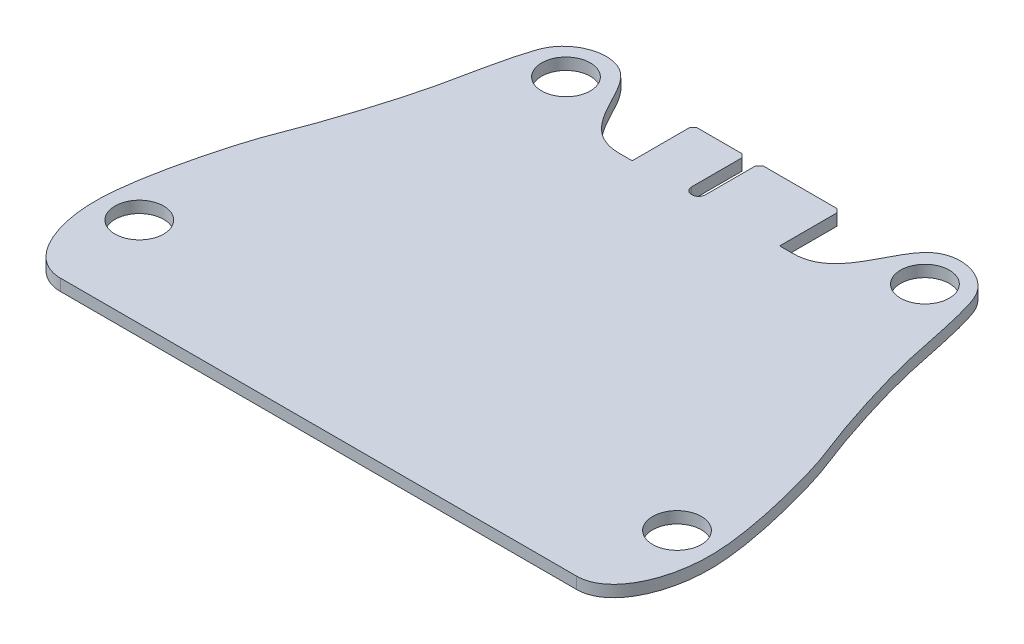
ISO-10303-21;
HEADER;
FILE_DESCRIPTION(('STEP AP214'),'2;1');
FILE_NAME('part.step','',(''),(''),'','','');
FILE_SCHEMA(('AUTOMOTIVE_DESIGN { 1 0 10303 214 1 1 1 1 }'));
ENDSEC;
DATA;
#1=APPLICATION_CONTEXT('core data for automotive mechanical design processes');
#2=APPLICATION_PROTOCOL_DEFINITION('international standard','automotive_design',2000,#1);
#3=PRODUCT_CONTEXT('',#1,'mechanical');
#4=PRODUCT('Part','Part','',(#3));
#5=PRODUCT_RELATED_PRODUCT_CATEGORY('part','',(#4));
#6=PRODUCT_DEFINITION_FORMATION('','',#4);
#7=PRODUCT_DEFINITION_CONTEXT('part definition',#1,'design');
#8=PRODUCT_DEFINITION('design','',#6,#7);
#9=PRODUCT_DEFINITION_SHAPE('','',#8);
#10=(LENGTH_UNIT() NAMED_UNIT(*) SI_UNIT(.MILLI.,.METRE.));
#11=(NAMED_UNIT(*) PLANE_ANGLE_UNIT() SI_UNIT($,.RADIAN.));
#12=(NAMED_UNIT(*) SI_UNIT($,.STERADIAN.) SOLID_ANGLE_UNIT());
#13=UNCERTAINTY_MEASURE_WITH_UNIT(LENGTH_MEASURE(1.E-05),#10,'distance_accuracy_value','');
#14=(GEOMETRIC_REPRESENTATION_CONTEXT(3) GLOBAL_UNCERTAINTY_ASSIGNED_CONTEXT((#13)) GLOBAL_UNIT_ASSIGNED_CONTEXT((#10,
#11,#12)) REPRESENTATION_CONTEXT('',''));
#15=CARTESIAN_POINT('',(0.,0.,0.));
#16=DIRECTION('',(0.,0.,1.));
#17=DIRECTION('',(1.,0.,0.));
#18=AXIS2_PLACEMENT_3D('',#15,#16,#17);
#19=CARTESIAN_POINT('',(-2.,-0.8,-29.258496614902));
#20=DIRECTION('',(0.,1.,0.));
#21=DIRECTION('',(0.,0.,1.));
#22=AXIS2_PLACEMENT_3D('',#19,#20,#21);
#23=CYLINDRICAL_SURFACE('',#22,0.951237048088933);
#24=DIRECTION('',(0.,1.,0.));
#25=VECTOR('',#24,1.);
#26=CARTESIAN_POINT('',(-2.95,-0.8,-29.21));
#27=LINE('',#26,#25);
#28=CARTESIAN_POINT('',(-2.95,-0.8,-29.21));
#29=VERTEX_POINT('',#28);
#30=CARTESIAN_POINT('',(-2.95,0.8,-29.21));
#31=VERTEX_POINT('',#30);
#32=EDGE_CURVE('E45',#29,#31,#27,.T.);
#33=ORIENTED_EDGE('',*,*,#32,.T.);
#34=CARTESIAN_POINT('',(-2.,0.8,-29.258496614902));
#35=DIRECTION('',(0.,1.,0.));
#36=DIRECTION('',(0.,0.,1.));
#37=AXIS2_PLACEMENT_3D('',#34,#35,#36);
#38=CIRCLE('',#37,0.951237048088933);
#39=CARTESIAN_POINT('',(-1.05,0.8,-29.21));
#40=VERTEX_POINT('',#39);
#41=EDGE_CURVE('E155',#31,#40,#38,.T.);
#42=ORIENTED_EDGE('',*,*,#41,.T.);
#43=DIRECTION('',(0.,1.,0.));
#44=VECTOR('',#43,1.);
#45=CARTESIAN_POINT('',(-1.05,-0.8,-29.21));
#46=LINE('',#45,#44);
#47=CARTESIAN_POINT('',(-1.05,-0.8,-29.21));
#48=VERTEX_POINT('',#47);
#49=EDGE_CURVE('E11',#48,#40,#46,.T.);
#50=ORIENTED_EDGE('',*,*,#49,.F.);
#51=CARTESIAN_POINT('',(-2.,-0.8,-29.258496614902));
#52=DIRECTION('',(0.,1.,0.));
#53=DIRECTION('',(0.,0.,1.));
#54=AXIS2_PLACEMENT_3D('',#51,#52,#53);
#55=CIRCLE('',#54,0.951237048088933);
#56=EDGE_CURVE('E157',#29,#48,#55,.T.);
#57=ORIENTED_EDGE('',*,*,#56,.F.);
#58=EDGE_LOOP('',(#33,#42,#50,#57));
#59=FACE_BOUND('',#58,.T.);
#60=ADVANCED_FACE('F42',(#59),#23,.F.);
#61=CARTESIAN_POINT('',(-1.05,-0.8,0.));
#62=DIRECTION('',(1.,0.,0.));
#63=DIRECTION('',(0.,0.,-1.));
#64=AXIS2_PLACEMENT_3D('',#61,#62,#63);
#65=PLANE('',#64);
#66=ORIENTED_EDGE('',*,*,#49,.T.);
#67=DIRECTION('',(0.,0.,-1.));
#68=VECTOR('',#67,1.);
#69=CARTESIAN_POINT('',(-1.05,0.8,0.));
#70=LINE('',#69,#68);
#71=CARTESIAN_POINT('',(-1.05,0.8,-36.16));
#72=VERTEX_POINT('',#71);
#73=EDGE_CURVE('E172',#40,#72,#70,.T.);
#74=ORIENTED_EDGE('',*,*,#73,.T.);
#75=DIRECTION('',(0.,1.,0.));
#76=VECTOR('',#75,1.);
#77=CARTESIAN_POINT('',(-1.05,-0.8,-36.16));
#78=LINE('',#77,#76);
#79=CARTESIAN_POINT('',(-1.05,-0.8,-36.16));
#80=VERTEX_POINT('',#79);
#81=EDGE_CURVE('E50',#80,#72,#78,.T.);
#82=ORIENTED_EDGE('',*,*,#81,.F.);
#83=DIRECTION('',(0.,0.,-1.));
#84=VECTOR('',#83,1.);
#85=CARTESIAN_POINT('',(-1.05,-0.8,0.));
#86=LINE('',#85,#84);
#87=EDGE_CURVE('E57',#48,#80,#86,.T.);
#88=ORIENTED_EDGE('',*,*,#87,.F.);
#89=EDGE_LOOP('',(#66,#74,#82,#88));
#90=FACE_BOUND('',#89,.T.);
#91=ADVANCED_FACE('F306',(#90),#65,.F.);
#92=CARTESIAN_POINT('',(-18.605,-0.8,-18.605));
#93=DIRECTION('',(0.707106781186548,0.,0.707106781186548));
#94=DIRECTION('',(0.707106781186548,0.,-0.707106781186548));
#95=AXIS2_PLACEMENT_3D('',#92,#93,#94);
#96=PLANE('',#95);
#97=ORIENTED_EDGE('',*,*,#81,.T.);
#98=DIRECTION('',(0.707106781186548,0.,-0.707106781186548));
#99=VECTOR('',#98,1.);
#100=CARTESIAN_POINT('',(-18.605,0.8,-18.605));
#101=LINE('',#100,#99);
#102=CARTESIAN_POINT('',(-0.550000000000002,0.8,-36.66));
#103=VERTEX_POINT('',#102);
#104=EDGE_CURVE('E223',#72,#103,#101,.T.);
#105=ORIENTED_EDGE('',*,*,#104,.T.);
#106=DIRECTION('',(0.,1.,0.));
#107=VECTOR('',#106,1.);
#108=CARTESIAN_POINT('',(-0.550000000000002,-0.8,-36.66));
#109=LINE('',#108,#107);
#110=CARTESIAN_POINT('',(-0.550000000000002,-0.8,-36.66));
#111=VERTEX_POINT('',#110);
#112=EDGE_CURVE('E368',#111,#103,#109,.T.);
#113=ORIENTED_EDGE('',*,*,#112,.F.);
#114=DIRECTION('',(0.707106781186548,0.,-0.707106781186548));
#115=VECTOR('',#114,1.);
#116=CARTESIAN_POINT('',(-18.605,-0.8,-18.605));
#117=LINE('',#116,#115);
#118=EDGE_CURVE('E353',#80,#111,#117,.T.);
#119=ORIENTED_EDGE('',*,*,#118,.F.);
#120=EDGE_LOOP('',(#97,#105,#113,#119));
#121=FACE_BOUND('',#120,.T.);
#122=ADVANCED_FACE('F310',(#121),#96,.F.);
#123=CARTESIAN_POINT('',(0.,-0.8,-36.66));
#124=DIRECTION('',(0.,0.,1.));
#125=DIRECTION('',(1.,0.,0.));
#126=AXIS2_PLACEMENT_3D('',#123,#124,#125);
#127=PLANE('',#126);
#128=ORIENTED_EDGE('',*,*,#112,.T.);
#129=DIRECTION('',(1.,0.,0.));
#130=VECTOR('',#129,1.);
#131=CARTESIAN_POINT('',(0.,0.8,-36.66));
#132=LINE('',#131,#130);
#133=CARTESIAN_POINT('',(9.65,0.8,-36.66));
#134=VERTEX_POINT('',#133);
#135=EDGE_CURVE('E220',#103,#134,#132,.T.);
#136=ORIENTED_EDGE('',*,*,#135,.T.);
#137=DIRECTION('',(0.,1.,0.));
#138=VECTOR('',#137,1.);
#139=CARTESIAN_POINT('',(9.65,-0.8,-36.66));
#140=LINE('',#139,#138);
#141=CARTESIAN_POINT('',(9.65,-0.8,-36.66));
#142=VERTEX_POINT('',#141);
#143=EDGE_CURVE('E370',#142,#134,#140,.T.);
#144=ORIENTED_EDGE('',*,*,#143,.F.);
#145=DIRECTION('',(1.,0.,0.));
#146=VECTOR('',#145,1.);
#147=CARTESIAN_POINT('',(0.,-0.8,-36.66));
#148=LINE('',#147,#146);
#149=EDGE_CURVE('E351',#111,#142,#148,.T.);
#150=ORIENTED_EDGE('',*,*,#149,.F.);
#151=EDGE_LOOP('',(#128,#136,#144,#150));
#152=FACE_BOUND('',#151,.T.);
#153=ADVANCED_FACE('F315',(#152),#127,.F.);
#154=CARTESIAN_POINT('',(23.155,-0.8,-23.155));
#155=DIRECTION('',(-0.707106781186548,0.,0.707106781186548));
#156=DIRECTION('',(0.707106781186548,0.,0.707106781186548));
#157=AXIS2_PLACEMENT_3D('',#154,#155,#156);
#158=PLANE('',#157);
#159=ORIENTED_EDGE('',*,*,#143,.T.);
#160=DIRECTION('',(0.707106781186548,0.,0.707106781186548));
#161=VECTOR('',#160,1.);
#162=CARTESIAN_POINT('',(23.155,0.8,-23.155));
#163=LINE('',#162,#161);
#164=CARTESIAN_POINT('',(10.15,0.8,-36.16));
#165=VERTEX_POINT('',#164);
#166=EDGE_CURVE('E217',#134,#165,#163,.T.);
#167=ORIENTED_EDGE('',*,*,#166,.T.);
#168=DIRECTION('',(0.,1.,0.));
#169=VECTOR('',#168,1.);
#170=CARTESIAN_POINT('',(10.15,-0.8,-36.16));
#171=LINE('',#170,#169);
#172=CARTESIAN_POINT('',(10.15,-0.8,-36.16));
#173=VERTEX_POINT('',#172);
#174=EDGE_CURVE('E372',#173,#165,#171,.T.);
#175=ORIENTED_EDGE('',*,*,#174,.F.);
#176=DIRECTION('',(0.707106781186548,0.,0.707106781186548));
#177=VECTOR('',#176,1.);
#178=CARTESIAN_POINT('',(23.155,-0.8,-23.155));
#179=LINE('',#178,#177);
#180=EDGE_CURVE('E349',#142,#173,#179,.T.);
#181=ORIENTED_EDGE('',*,*,#180,.F.);
#182=EDGE_LOOP('',(#159,#167,#175,#181));
#183=FACE_BOUND('',#182,.T.);
#184=ADVANCED_FACE('F322',(#183),#158,.F.);
#185=CARTESIAN_POINT('',(10.15,-0.8,0.));
#186=DIRECTION('',(-1.,0.,0.));
#187=DIRECTION('',(0.,0.,1.));
#188=AXIS2_PLACEMENT_3D('',#185,#186,#187);
#189=PLANE('',#188);
#190=ORIENTED_EDGE('',*,*,#174,.T.);
#191=DIRECTION('',(0.,0.,1.));
#192=VECTOR('',#191,1.);
#193=CARTESIAN_POINT('',(10.15,0.8,0.));
#194=LINE('',#193,#192);
#195=CARTESIAN_POINT('',(10.15,0.8,-28.26));
#196=VERTEX_POINT('',#195);
#197=EDGE_CURVE('E214',#165,#196,#194,.T.);
#198=ORIENTED_EDGE('',*,*,#197,.T.);
#199=DIRECTION('',(0.,1.,0.));
#200=VECTOR('',#199,1.);
#201=CARTESIAN_POINT('',(10.15,-0.8,-28.26));
#202=LINE('',#201,#200);
#203=CARTESIAN_POINT('',(10.15,-0.8,-28.26));
#204=VERTEX_POINT('',#203);
#205=EDGE_CURVE('E374',#204,#196,#202,.T.);
#206=ORIENTED_EDGE('',*,*,#205,.F.);
#207=DIRECTION('',(0.,0.,1.));
#208=VECTOR('',#207,1.);
#209=CARTESIAN_POINT('',(10.15,-0.8,0.));
#210=LINE('',#209,#208);
#211=EDGE_CURVE('E347',#173,#204,#210,.T.);
#212=ORIENTED_EDGE('',*,*,#211,.F.);
#213=EDGE_LOOP('',(#190,#198,#206,#212));
#214=FACE_BOUND('',#213,.T.);
#215=ADVANCED_FACE('F326',(#214),#189,.F.);
#216=CARTESIAN_POINT('',(0.,-0.8,-28.26));
#217=DIRECTION('',(0.,0.,1.));
#218=DIRECTION('',(1.,0.,0.));
#219=AXIS2_PLACEMENT_3D('',#216,#217,#218);
#220=PLANE('',#219);
#221=ORIENTED_EDGE('',*,*,#205,.T.);
#222=DIRECTION('',(1.,0.,0.));
#223=VECTOR('',#222,1.);
#224=CARTESIAN_POINT('',(0.,0.8,-28.26));
#225=LINE('',#224,#223);
#226=CARTESIAN_POINT('',(11.9401737997279,0.8,-28.26));
#227=VERTEX_POINT('',#226);
#228=EDGE_CURVE('E208',#196,#227,#225,.T.);
#229=ORIENTED_EDGE('',*,*,#228,.T.);
#230=DIRECTION('',(0.,1.,0.));
#231=VECTOR('',#230,1.);
#232=CARTESIAN_POINT('',(11.9401737997279,-0.8,-28.26));
#233=LINE('',#232,#231);
#234=CARTESIAN_POINT('',(11.9401737997279,-0.8,-28.26));
#235=VERTEX_POINT('',#234);
#236=EDGE_CURVE('E376',#235,#227,#233,.T.);
#237=ORIENTED_EDGE('',*,*,#236,.F.);
#238=DIRECTION('',(1.,0.,0.));
#239=VECTOR('',#238,1.);
#240=CARTESIAN_POINT('',(0.,-0.8,-28.26));
#241=LINE('',#240,#239);
#242=EDGE_CURVE('E342',#204,#235,#241,.T.);
#243=ORIENTED_EDGE('',*,*,#242,.F.);
#244=EDGE_LOOP('',(#221,#229,#237,#243));
#245=FACE_BOUND('',#244,.T.);
#246=ADVANCED_FACE('F330',(#245),#220,.F.);
#247=CARTESIAN_POINT('',(11.9401737997279,-0.8,-28.26));
#248=CARTESIAN_POINT('',(17.7701846046588,-0.8,-28.26));
#249=CARTESIAN_POINT('',(18.8530750710373,-0.8,-41.213115457032));
#250=CARTESIAN_POINT('',(28.7671532352793,-0.8,-38.5389578110613));
#251=CARTESIAN_POINT('',(31.2832424463367,-0.8,-30.8578871157047));
#252=CARTESIAN_POINT('',(32.2630881203703,-0.8,-23.2646495894132));
#253=CARTESIAN_POINT('',(36.4812625861029,-0.8,-10.4009561938267));
#254=CARTESIAN_POINT('',(39.0503733017261,-0.8,-4.22006007186746));
#255=CARTESIAN_POINT('',(42.3075870248585,-0.8,7.83357055671681));
#256=CARTESIAN_POINT('',(42.3333242155537,-0.8,19.4207759035153));
#257=CARTESIAN_POINT('',(39.3741864233012,-0.8,25.0700000000004));
#258=CARTESIAN_POINT('',(35.5208994651826,-0.8,25.07));
#259=B_SPLINE_CURVE_WITH_KNOTS('',3,(#247,#248,#249,#250,#251,#252,#253,#254,#255,#256,#257,
#258),.UNSPECIFIED.,.F.,.F.,(4,1,1,1,1,1,1,1,1,4),(0.,0.162529727020018,0.293884615323504,
0.325936320233385,0.483046776118821,0.646953908826158,0.682356014052539,0.819877626790395,
0.853361045544364,1.),.UNSPECIFIED.);
#260=DIRECTION('',(0.,1.,0.));
#261=VECTOR('',#260,1.);
#262=SURFACE_OF_LINEAR_EXTRUSION('',#259,#261);
#263=ORIENTED_EDGE('',*,*,#236,.T.);
#264=CARTESIAN_POINT('',(11.9401737997279,0.8,-28.26));
#265=CARTESIAN_POINT('',(17.7701846046588,0.8,-28.26));
#266=CARTESIAN_POINT('',(18.8530750710373,0.8,-41.213115457032));
#267=CARTESIAN_POINT('',(28.7671532352793,0.8,-38.5389578110613));
#268=CARTESIAN_POINT('',(31.2832424463367,0.8,-30.8578871157047));
#269=CARTESIAN_POINT('',(32.2630881203703,0.8,-23.2646495894132));
#270=CARTESIAN_POINT('',(36.4812625861029,0.8,-10.4009561938267));
#271=CARTESIAN_POINT('',(39.0503733017261,0.8,-4.22006007186746));
#272=CARTESIAN_POINT('',(42.3075870248585,0.8,7.83357055671681));
#273=CARTESIAN_POINT('',(42.3333242155537,0.8,19.4207759035153));
#274=CARTESIAN_POINT('',(39.3741864233012,0.8,25.0700000000004));
#275=CARTESIAN_POINT('',(35.5208994651826,0.8,25.07));
#276=B_SPLINE_CURVE_WITH_KNOTS('',3,(#264,#265,#266,#267,#268,#269,#270,#271,#272,#273,#274,
#275),.UNSPECIFIED.,.F.,.F.,(4,1,1,1,1,1,1,1,1,4),(0.,0.162529727020018,0.293884615323504,
0.325936320233385,0.483046776118821,0.646953908826158,0.682356014052539,0.819877626790395,
0.853361045544364,1.),.UNSPECIFIED.);
#277=CARTESIAN_POINT('',(35.5208994651828,0.8,25.07));
#278=VERTEX_POINT('',#277);
#279=EDGE_CURVE('E203',#227,#278,#276,.T.);
#280=ORIENTED_EDGE('',*,*,#279,.T.);
#281=DIRECTION('',(0.,1.,0.));
#282=VECTOR('',#281,1.);
#283=CARTESIAN_POINT('',(35.5208994651828,-0.8,25.07));
#284=LINE('',#283,#282);
#285=CARTESIAN_POINT('',(35.5208994651828,-0.8,25.07));
#286=VERTEX_POINT('',#285);
#287=EDGE_CURVE('E378',#286,#278,#284,.T.);
#288=ORIENTED_EDGE('',*,*,#287,.F.);
#289=EDGE_CURVE('E337',#235,#286,#259,.T.);
#290=ORIENTED_EDGE('',*,*,#289,.F.);
#291=EDGE_LOOP('',(#263,#280,#288,#290));
#292=FACE_BOUND('',#291,.T.);
#293=ADVANCED_FACE('F333',(#292),#262,.F.);
#294=CARTESIAN_POINT('',(0.,-0.8,25.07));
#295=DIRECTION('',(0.,0.,1.));
#296=DIRECTION('',(1.,0.,0.));
#297=AXIS2_PLACEMENT_3D('',#294,#295,#296);
#298=PLANE('',#297);
#299=ORIENTED_EDGE('',*,*,#287,.T.);
#300=DIRECTION('',(1.,0.,0.));
#301=VECTOR('',#300,1.);
#302=CARTESIAN_POINT('',(0.,0.8,25.07));
#303=LINE('',#302,#301);
#304=CARTESIAN_POINT('',(-35.5208994651828,0.8,25.07));
#305=VERTEX_POINT('',#304);
#306=EDGE_CURVE('E197',#305,#278,#303,.T.);
#307=ORIENTED_EDGE('',*,*,#306,.F.);
#308=DIRECTION('',(0.,1.,0.));
#309=VECTOR('',#308,1.);
#310=CARTESIAN_POINT('',(-35.5208994651828,-0.8,25.07));
#311=LINE('',#310,#309);
#312=CARTESIAN_POINT('',(-35.5208994651828,-0.8,25.07));
#313=VERTEX_POINT('',#312);
#314=EDGE_CURVE('E380',#313,#305,#311,.T.);
#315=ORIENTED_EDGE('',*,*,#314,.F.);
#316=DIRECTION('',(1.,0.,0.));
#317=VECTOR('',#316,1.);
#318=CARTESIAN_POINT('',(0.,-0.8,25.07));
#319=LINE('',#318,#317);
#320=EDGE_CURVE('E259',#313,#286,#319,.T.);
#321=ORIENTED_EDGE('',*,*,#320,.T.);
#322=EDGE_LOOP('',(#299,#307,#315,#321));
#323=FACE_BOUND('',#322,.T.);
#324=ADVANCED_FACE('F270',(#323),#298,.T.);
#325=CARTESIAN_POINT('',(-11.9401737997279,-0.8,-28.26));
#326=CARTESIAN_POINT('',(-17.7701846046588,-0.8,-28.26));
#327=CARTESIAN_POINT('',(-18.8530750710373,-0.8,-41.213115457032));
#328=CARTESIAN_POINT('',(-28.7671532352793,-0.8,-38.5389578110613));
#329=CARTESIAN_POINT('',(-31.2832424463367,-0.8,-30.8578871157047));
#330=CARTESIAN_POINT('',(-32.2630881203703,-0.8,-23.2646495894132));
#331=CARTESIAN_POINT('',(-36.4812625861029,-0.8,-10.4009561938267));
#332=CARTESIAN_POINT('',(-39.0503733017261,-0.8,-4.22006007186746));
#333=CARTESIAN_POINT('',(-42.3075870248584,-0.8,7.83357055671681));
#334=CARTESIAN_POINT('',(-42.3333242155537,-0.8,19.4207759035153));
#335=CARTESIAN_POINT('',(-39.3741864233012,-0.8,25.0700000000004));
#336=CARTESIAN_POINT('',(-35.5208994651826,-0.8,25.07));
#337=B_SPLINE_CURVE_WITH_KNOTS('',3,(#325,#326,#327,#328,#329,#330,#331,#332,#333,#334,#335,
#336),.UNSPECIFIED.,.F.,.F.,(4,1,1,1,1,1,1,1,1,4),(0.,0.162529727020018,0.293884615323504,
0.325936320233385,0.483046776118821,0.646953908826158,0.682356014052539,0.819877626790395,
0.853361045544364,1.),.UNSPECIFIED.);
#338=DIRECTION('',(0.,1.,0.));
#339=VECTOR('',#338,1.);
#340=SURFACE_OF_LINEAR_EXTRUSION('',#337,#339);
#341=ORIENTED_EDGE('',*,*,#314,.T.);
#342=CARTESIAN_POINT('',(-11.9401737997279,0.8,-28.26));
#343=CARTESIAN_POINT('',(-17.7701846046588,0.8,-28.26));
#344=CARTESIAN_POINT('',(-18.8530750710373,0.8,-41.213115457032));
#345=CARTESIAN_POINT('',(-28.7671532352793,0.8,-38.5389578110613));
#346=CARTESIAN_POINT('',(-31.2832424463367,0.8,-30.8578871157047));
#347=CARTESIAN_POINT('',(-32.2630881203703,0.8,-23.2646495894132));
#348=CARTESIAN_POINT('',(-36.4812625861029,0.8,-10.4009561938267));
#349=CARTESIAN_POINT('',(-39.0503733017261,0.8,-4.22006007186746));
#350=CARTESIAN_POINT('',(-42.3075870248584,0.8,7.83357055671681));
#351=CARTESIAN_POINT('',(-42.3333242155537,0.8,19.4207759035153));
#352=CARTESIAN_POINT('',(-39.3741864233012,0.8,25.0700000000004));
#353=CARTESIAN_POINT('',(-35.5208994651826,0.8,25.07));
#354=B_SPLINE_CURVE_WITH_KNOTS('',3,(#342,#343,#344,#345,#346,#347,#348,#349,#350,#351,#352,
#353),.UNSPECIFIED.,.F.,.F.,(4,1,1,1,1,1,1,1,1,4),(0.,0.162529727020018,0.293884615323504,
0.325936320233385,0.483046776118821,0.646953908826158,0.682356014052539,0.819877626790395,
0.853361045544364,1.),.UNSPECIFIED.);
#355=CARTESIAN_POINT('',(-11.9401737997279,0.8,-28.26));
#356=VERTEX_POINT('',#355);
#357=EDGE_CURVE('E192',#356,#305,#354,.T.);
#358=ORIENTED_EDGE('',*,*,#357,.F.);
#359=DIRECTION('',(0.,1.,0.));
#360=VECTOR('',#359,1.);
#361=CARTESIAN_POINT('',(-11.9401737997279,-0.8,-28.26));
#362=LINE('',#361,#360);
#363=CARTESIAN_POINT('',(-11.9401737997279,-0.8,-28.26));
#364=VERTEX_POINT('',#363);
#365=EDGE_CURVE('E382',#364,#356,#362,.T.);
#366=ORIENTED_EDGE('',*,*,#365,.F.);
#367=EDGE_CURVE('E253',#364,#313,#337,.T.);
#368=ORIENTED_EDGE('',*,*,#367,.T.);
#369=EDGE_LOOP('',(#341,#358,#366,#368));
#370=FACE_BOUND('',#369,.T.);
#371=ADVANCED_FACE('F265',(#370),#340,.T.);
#372=CARTESIAN_POINT('',(0.,-0.8,-28.26));
#373=DIRECTION('',(0.,0.,-1.));
#374=DIRECTION('',(-1.,0.,0.));
#375=AXIS2_PLACEMENT_3D('',#372,#373,#374);
#376=PLANE('',#375);
#377=ORIENTED_EDGE('',*,*,#365,.T.);
#378=DIRECTION('',(-1.,0.,0.));
#379=VECTOR('',#378,1.);
#380=CARTESIAN_POINT('',(0.,0.8,-28.26));
#381=LINE('',#380,#379);
#382=CARTESIAN_POINT('',(-10.15,0.8,-28.26));
#383=VERTEX_POINT('',#382);
#384=EDGE_CURVE('E189',#383,#356,#381,.T.);
#385=ORIENTED_EDGE('',*,*,#384,.F.);
#386=DIRECTION('',(0.,1.,0.));
#387=VECTOR('',#386,1.);
#388=CARTESIAN_POINT('',(-10.15,-0.8,-28.26));
#389=LINE('',#388,#387);
#390=CARTESIAN_POINT('',(-10.15,-0.8,-28.26));
#391=VERTEX_POINT('',#390);
#392=EDGE_CURVE('E384',#391,#383,#389,.T.);
#393=ORIENTED_EDGE('',*,*,#392,.F.);
#394=DIRECTION('',(-1.,0.,0.));
#395=VECTOR('',#394,1.);
#396=CARTESIAN_POINT('',(0.,-0.8,-28.26));
#397=LINE('',#396,#395);
#398=EDGE_CURVE('E250',#391,#364,#397,.T.);
#399=ORIENTED_EDGE('',*,*,#398,.T.);
#400=EDGE_LOOP('',(#377,#385,#393,#399));
#401=FACE_BOUND('',#400,.T.);
#402=ADVANCED_FACE('F269',(#401),#376,.T.);
#403=CARTESIAN_POINT('',(-10.15,-0.8,0.));
#404=DIRECTION('',(1.,0.,0.));
#405=DIRECTION('',(0.,0.,-1.));
#406=AXIS2_PLACEMENT_3D('',#403,#404,#405);
#407=PLANE('',#406);
#408=ORIENTED_EDGE('',*,*,#392,.T.);
#409=DIRECTION('',(0.,0.,-1.));
#410=VECTOR('',#409,1.);
#411=CARTESIAN_POINT('',(-10.15,0.8,0.));
#412=LINE('',#411,#410);
#413=CARTESIAN_POINT('',(-10.15,0.8,-36.16));
#414=VERTEX_POINT('',#413);
#415=EDGE_CURVE('E186',#383,#414,#412,.T.);
#416=ORIENTED_EDGE('',*,*,#415,.T.);
#417=DIRECTION('',(0.,1.,0.));
#418=VECTOR('',#417,1.);
#419=CARTESIAN_POINT('',(-10.15,-0.8,-36.16));
#420=LINE('',#419,#418);
#421=CARTESIAN_POINT('',(-10.15,-0.8,-36.16));
#422=VERTEX_POINT('',#421);
#423=EDGE_CURVE('E386',#422,#414,#420,.T.);
#424=ORIENTED_EDGE('',*,*,#423,.F.);
#425=DIRECTION('',(0.,0.,-1.));
#426=VECTOR('',#425,1.);
#427=CARTESIAN_POINT('',(-10.15,-0.8,0.));
#428=LINE('',#427,#426);
#429=EDGE_CURVE('E248',#391,#422,#428,.T.);
#430=ORIENTED_EDGE('',*,*,#429,.F.);
#431=EDGE_LOOP('',(#408,#416,#424,#430));
#432=FACE_BOUND('',#431,.T.);
#433=ADVANCED_FACE('F275',(#432),#407,.F.);
#434=CARTESIAN_POINT('',(-23.155,-0.8,-23.155));
#435=DIRECTION('',(0.707106781186548,0.,0.707106781186548));
#436=DIRECTION('',(0.707106781186548,0.,-0.707106781186548));
#437=AXIS2_PLACEMENT_3D('',#434,#435,#436);
#438=PLANE('',#437);
#439=ORIENTED_EDGE('',*,*,#423,.T.);
#440=DIRECTION('',(0.707106781186548,0.,-0.707106781186548));
#441=VECTOR('',#440,1.);
#442=CARTESIAN_POINT('',(-23.155,0.8,-23.155));
#443=LINE('',#442,#441);
#444=CARTESIAN_POINT('',(-9.65,0.8,-36.66));
#445=VERTEX_POINT('',#444);
#446=EDGE_CURVE('E183',#414,#445,#443,.T.);
#447=ORIENTED_EDGE('',*,*,#446,.T.);
#448=DIRECTION('',(0.,1.,0.));
#449=VECTOR('',#448,1.);
#450=CARTESIAN_POINT('',(-9.65,-0.8,-36.66));
#451=LINE('',#450,#449);
#452=CARTESIAN_POINT('',(-9.65,-0.8,-36.66));
#453=VERTEX_POINT('',#452);
#454=EDGE_CURVE('E388',#453,#445,#451,.T.);
#455=ORIENTED_EDGE('',*,*,#454,.F.);
#456=DIRECTION('',(0.707106781186548,0.,-0.707106781186548));
#457=VECTOR('',#456,1.);
#458=CARTESIAN_POINT('',(-23.155,-0.8,-23.155));
#459=LINE('',#458,#457);
#460=EDGE_CURVE('E246',#422,#453,#459,.T.);
#461=ORIENTED_EDGE('',*,*,#460,.F.);
#462=EDGE_LOOP('',(#439,#447,#455,#461));
#463=FACE_BOUND('',#462,.T.);
#464=ADVANCED_FACE('F279',(#463),#438,.F.);
#465=CARTESIAN_POINT('',(0.,-0.8,-36.66));
#466=DIRECTION('',(0.,0.,1.));
#467=DIRECTION('',(1.,0.,0.));
#468=AXIS2_PLACEMENT_3D('',#465,#466,#467);
#469=PLANE('',#468);
#470=ORIENTED_EDGE('',*,*,#454,.T.);
#471=DIRECTION('',(1.,0.,0.));
#472=VECTOR('',#471,1.);
#473=CARTESIAN_POINT('',(0.,0.8,-36.66));
#474=LINE('',#473,#472);
#475=CARTESIAN_POINT('',(-3.45000000000001,0.8,-36.66));
#476=VERTEX_POINT('',#475);
#477=EDGE_CURVE('E178',#445,#476,#474,.T.);
#478=ORIENTED_EDGE('',*,*,#477,.T.);
#479=DIRECTION('',(0.,1.,0.));
#480=VECTOR('',#479,1.);
#481=CARTESIAN_POINT('',(-3.45000000000001,-0.8,-36.66));
#482=LINE('',#481,#480);
#483=CARTESIAN_POINT('',(-3.45000000000001,-0.8,-36.66));
#484=VERTEX_POINT('',#483);
#485=EDGE_CURVE('E390',#484,#476,#482,.T.);
#486=ORIENTED_EDGE('',*,*,#485,.F.);
#487=DIRECTION('',(1.,0.,0.));
#488=VECTOR('',#487,1.);
#489=CARTESIAN_POINT('',(0.,-0.8,-36.66));
#490=LINE('',#489,#488);
#491=EDGE_CURVE('E244',#453,#484,#490,.T.);
#492=ORIENTED_EDGE('',*,*,#491,.F.);
#493=EDGE_LOOP('',(#470,#478,#486,#492));
#494=FACE_BOUND('',#493,.T.);
#495=ADVANCED_FACE('F283',(#494),#469,.F.);
#496=CARTESIAN_POINT('',(16.605,-0.8,-16.605));
#497=DIRECTION('',(-0.707106781186548,0.,0.707106781186548));
#498=DIRECTION('',(0.707106781186548,0.,0.707106781186548));
#499=AXIS2_PLACEMENT_3D('',#496,#497,#498);
#500=PLANE('',#499);
#501=ORIENTED_EDGE('',*,*,#485,.T.);
#502=DIRECTION('',(0.707106781186548,0.,0.707106781186548));
#503=VECTOR('',#502,1.);
#504=CARTESIAN_POINT('',(16.605,0.8,-16.605));
#505=LINE('',#504,#503);
#506=CARTESIAN_POINT('',(-2.95,0.8,-36.16));
#507=VERTEX_POINT('',#506);
#508=EDGE_CURVE('E176',#476,#507,#505,.T.);
#509=ORIENTED_EDGE('',*,*,#508,.T.);
#510=DIRECTION('',(0.,1.,0.));
#511=VECTOR('',#510,1.);
#512=CARTESIAN_POINT('',(-2.95,-0.8,-36.16));
#513=LINE('',#512,#511);
#514=CARTESIAN_POINT('',(-2.95,-0.8,-36.16));
#515=VERTEX_POINT('',#514);
#516=EDGE_CURVE('E161',#515,#507,#513,.T.);
#517=ORIENTED_EDGE('',*,*,#516,.F.);
#518=DIRECTION('',(0.707106781186548,0.,0.707106781186548));
#519=VECTOR('',#518,1.);
#520=CARTESIAN_POINT('',(16.605,-0.8,-16.605));
#521=LINE('',#520,#519);
#522=EDGE_CURVE('E242',#484,#515,#521,.T.);
#523=ORIENTED_EDGE('',*,*,#522,.F.);
#524=EDGE_LOOP('',(#501,#509,#517,#523));
#525=FACE_BOUND('',#524,.T.);
#526=ADVANCED_FACE('F287',(#525),#500,.F.);
#527=CARTESIAN_POINT('',(-24.7,-0.8,-33.7));
#528=DIRECTION('',(0.,1.,0.));
#529=DIRECTION('',(0.,0.,1.));
#530=AXIS2_PLACEMENT_3D('',#527,#528,#529);
#531=CYLINDRICAL_SURFACE('',#530,3.35);
#532=CARTESIAN_POINT('',(-24.7,-0.8,-33.7));
#533=DIRECTION('',(0.,1.,0.));
#534=DIRECTION('',(0.,0.,1.));
#535=AXIS2_PLACEMENT_3D('',#532,#533,#534);
#536=CIRCLE('',#535,3.35);
#537=CARTESIAN_POINT('',(-24.7,-0.8,-30.35));
#538=VERTEX_POINT('',#537);
#539=EDGE_CURVE('E362',#538,#538,#536,.T.);
#540=ORIENTED_EDGE('',*,*,#539,.F.);
#541=EDGE_LOOP('',(#540));
#542=FACE_BOUND('',#541,.T.);
#543=CARTESIAN_POINT('',(-24.7,0.8,-33.7));
#544=DIRECTION('',(0.,1.,0.));
#545=DIRECTION('',(0.,0.,1.));
#546=AXIS2_PLACEMENT_3D('',#543,#544,#545);
#547=CIRCLE('',#546,3.35);
#548=CARTESIAN_POINT('',(-24.7,0.8,-30.35));
#549=VERTEX_POINT('',#548);
#550=EDGE_CURVE('E233',#549,#549,#547,.T.);
#551=ORIENTED_EDGE('',*,*,#550,.T.);
#552=EDGE_LOOP('',(#551));
#553=FACE_BOUND('',#552,.T.);
#554=ADVANCED_FACE('F290',(#542,#553),#531,.F.);
#555=CARTESIAN_POINT('',(-37.,-0.8,12.72));
#556=DIRECTION('',(0.,1.,0.));
#557=DIRECTION('',(0.,0.,1.));
#558=AXIS2_PLACEMENT_3D('',#555,#556,#557);
#559=CYLINDRICAL_SURFACE('',#558,3.34999999999999);
#560=CARTESIAN_POINT('',(-37.,-0.8,12.72));
#561=DIRECTION('',(0.,1.,0.));
#562=DIRECTION('',(0.,0.,1.));
#563=AXIS2_PLACEMENT_3D('',#560,#561,#562);
#564=CIRCLE('',#563,3.34999999999999);
#565=CARTESIAN_POINT('',(-37.,-0.8,16.07));
#566=VERTEX_POINT('',#565);
#567=EDGE_CURVE('E359',#566,#566,#564,.T.);
#568=ORIENTED_EDGE('',*,*,#567,.F.);
#569=EDGE_LOOP('',(#568));
#570=FACE_BOUND('',#569,.T.);
#571=CARTESIAN_POINT('',(-37.,0.8,12.72));
#572=DIRECTION('',(0.,1.,0.));
#573=DIRECTION('',(0.,0.,1.));
#574=AXIS2_PLACEMENT_3D('',#571,#572,#573);
#575=CIRCLE('',#574,3.34999999999999);
#576=CARTESIAN_POINT('',(-37.,0.8,16.07));
#577=VERTEX_POINT('',#576);
#578=EDGE_CURVE('E230',#577,#577,#575,.T.);
#579=ORIENTED_EDGE('',*,*,#578,.T.);
#580=EDGE_LOOP('',(#579));
#581=FACE_BOUND('',#580,.T.);
#582=ADVANCED_FACE('F302',(#570,#581),#559,.F.);
#583=CARTESIAN_POINT('',(37.,-0.8,12.72));
#584=DIRECTION('',(0.,1.,0.));
#585=DIRECTION('',(0.,0.,1.));
#586=AXIS2_PLACEMENT_3D('',#583,#584,#585);
#587=CYLINDRICAL_SURFACE('',#586,3.35);
#588=CARTESIAN_POINT('',(37.,-0.8,12.72));
#589=DIRECTION('',(0.,1.,0.));
#590=DIRECTION('',(0.,0.,1.));
#591=AXIS2_PLACEMENT_3D('',#588,#589,#590);
#592=CIRCLE('',#591,3.35);
#593=CARTESIAN_POINT('',(37.,-0.8,16.07));
#594=VERTEX_POINT('',#593);
#595=EDGE_CURVE('E356',#594,#594,#592,.F.);
#596=ORIENTED_EDGE('',*,*,#595,.T.);
#597=EDGE_LOOP('',(#596));
#598=FACE_BOUND('',#597,.T.);
#599=CARTESIAN_POINT('',(37.,0.8,12.72));
#600=DIRECTION('',(0.,1.,0.));
#601=DIRECTION('',(0.,0.,1.));
#602=AXIS2_PLACEMENT_3D('',#599,#600,#601);
#603=CIRCLE('',#602,3.35);
#604=CARTESIAN_POINT('',(37.,0.8,16.07));
#605=VERTEX_POINT('',#604);
#606=EDGE_CURVE('E227',#605,#605,#603,.F.);
#607=ORIENTED_EDGE('',*,*,#606,.F.);
#608=EDGE_LOOP('',(#607));
#609=FACE_BOUND('',#608,.T.);
#610=ADVANCED_FACE('F294',(#598,#609),#587,.F.);
#611=CARTESIAN_POINT('',(-2.95,-0.8,0.));
#612=DIRECTION('',(-1.,0.,0.));
#613=DIRECTION('',(0.,0.,1.));
#614=AXIS2_PLACEMENT_3D('',#611,#612,#613);
#615=PLANE('',#614);
#616=ORIENTED_EDGE('',*,*,#516,.T.);
#617=DIRECTION('',(0.,0.,1.));
#618=VECTOR('',#617,1.);
#619=CARTESIAN_POINT('',(-2.95,0.8,0.));
#620=LINE('',#619,#618);
#621=EDGE_CURVE('E168',#507,#31,#620,.T.);
#622=ORIENTED_EDGE('',*,*,#621,.T.);
#623=ORIENTED_EDGE('',*,*,#32,.F.);
#624=DIRECTION('',(0.,0.,1.));
#625=VECTOR('',#624,1.);
#626=CARTESIAN_POINT('',(-2.95,-0.8,0.));
#627=LINE('',#626,#625);
#628=EDGE_CURVE('E240',#515,#29,#627,.T.);
#629=ORIENTED_EDGE('',*,*,#628,.F.);
#630=EDGE_LOOP('',(#616,#622,#623,#629));
#631=FACE_BOUND('',#630,.T.);
#632=ADVANCED_FACE('F174',(#631),#615,.F.);
#633=CARTESIAN_POINT('',(24.7,-0.8,-33.7));
#634=DIRECTION('',(0.,1.,0.));
#635=DIRECTION('',(0.,0.,1.));
#636=AXIS2_PLACEMENT_3D('',#633,#634,#635);
#637=CYLINDRICAL_SURFACE('',#636,3.34999999999999);
#638=CARTESIAN_POINT('',(24.7,-0.8,-33.7));
#639=DIRECTION('',(0.,1.,0.));
#640=DIRECTION('',(0.,0.,1.));
#641=AXIS2_PLACEMENT_3D('',#638,#639,#640);
#642=CIRCLE('',#641,3.34999999999999);
#643=CARTESIAN_POINT('',(24.7,-0.8,-30.35));
#644=VERTEX_POINT('',#643);
#645=EDGE_CURVE('E162',#644,#644,#642,.F.);
#646=ORIENTED_EDGE('',*,*,#645,.T.);
#647=EDGE_LOOP('',(#646));
#648=FACE_BOUND('',#647,.T.);
#649=CARTESIAN_POINT('',(24.7,0.8,-33.7));
#650=DIRECTION('',(0.,1.,0.));
#651=DIRECTION('',(0.,0.,1.));
#652=AXIS2_PLACEMENT_3D('',#649,#650,#651);
#653=CIRCLE('',#652,3.34999999999999);
#654=CARTESIAN_POINT('',(24.7,0.8,-30.35));
#655=VERTEX_POINT('',#654);
#656=EDGE_CURVE('E236',#655,#655,#653,.F.);
#657=ORIENTED_EDGE('',*,*,#656,.F.);
#658=EDGE_LOOP('',(#657));
#659=FACE_BOUND('',#658,.T.);
#660=ADVANCED_FACE('F293',(#648,#659),#637,.F.);
#661=CARTESIAN_POINT('',(0.,-0.8,0.));
#662=DIRECTION('',(0.,1.,0.));
#663=DIRECTION('',(0.,0.,1.));
#664=AXIS2_PLACEMENT_3D('',#661,#662,#663);
#665=PLANE('',#664);
#666=ORIENTED_EDGE('',*,*,#56,.T.);
#667=ORIENTED_EDGE('',*,*,#87,.T.);
#668=ORIENTED_EDGE('',*,*,#118,.T.);
#669=ORIENTED_EDGE('',*,*,#149,.T.);
#670=ORIENTED_EDGE('',*,*,#180,.T.);
#671=ORIENTED_EDGE('',*,*,#211,.T.);
#672=ORIENTED_EDGE('',*,*,#242,.T.);
#673=ORIENTED_EDGE('',*,*,#289,.T.);
#674=ORIENTED_EDGE('',*,*,#320,.F.);
#675=ORIENTED_EDGE('',*,*,#367,.F.);
#676=ORIENTED_EDGE('',*,*,#398,.F.);
#677=ORIENTED_EDGE('',*,*,#429,.T.);
#678=ORIENTED_EDGE('',*,*,#460,.T.);
#679=ORIENTED_EDGE('',*,*,#491,.T.);
#680=ORIENTED_EDGE('',*,*,#522,.T.);
#681=ORIENTED_EDGE('',*,*,#628,.T.);
#682=EDGE_LOOP('',(#666,#667,#668,#669,#670,#671,#672,#673,#674,#675,#676,#677,#678,#679,#680,#681));
#683=FACE_BOUND('',#682,.T.);
#684=ORIENTED_EDGE('',*,*,#595,.F.);
#685=EDGE_LOOP('',(#684));
#686=FACE_BOUND('',#685,.T.);
#687=ORIENTED_EDGE('',*,*,#567,.T.);
#688=EDGE_LOOP('',(#687));
#689=FACE_BOUND('',#688,.T.);
#690=ORIENTED_EDGE('',*,*,#539,.T.);
#691=EDGE_LOOP('',(#690));
#692=FACE_BOUND('',#691,.T.);
#693=ORIENTED_EDGE('',*,*,#645,.F.);
#694=EDGE_LOOP('',(#693));
#695=FACE_BOUND('',#694,.T.);
#696=ADVANCED_FACE('F299',(#683,#686,#689,#692,#695),#665,.F.);
#697=CARTESIAN_POINT('',(0.,0.8,0.));
#698=DIRECTION('',(0.,1.,0.));
#699=DIRECTION('',(0.,0.,1.));
#700=AXIS2_PLACEMENT_3D('',#697,#698,#699);
#701=PLANE('',#700);
#702=ORIENTED_EDGE('',*,*,#41,.F.);
#703=ORIENTED_EDGE('',*,*,#621,.F.);
#704=ORIENTED_EDGE('',*,*,#508,.F.);
#705=ORIENTED_EDGE('',*,*,#477,.F.);
#706=ORIENTED_EDGE('',*,*,#446,.F.);
#707=ORIENTED_EDGE('',*,*,#415,.F.);
#708=ORIENTED_EDGE('',*,*,#384,.T.);
#709=ORIENTED_EDGE('',*,*,#357,.T.);
#710=ORIENTED_EDGE('',*,*,#306,.T.);
#711=ORIENTED_EDGE('',*,*,#279,.F.);
#712=ORIENTED_EDGE('',*,*,#228,.F.);
#713=ORIENTED_EDGE('',*,*,#197,.F.);
#714=ORIENTED_EDGE('',*,*,#166,.F.);
#715=ORIENTED_EDGE('',*,*,#135,.F.);
#716=ORIENTED_EDGE('',*,*,#104,.F.);
#717=ORIENTED_EDGE('',*,*,#73,.F.);
#718=EDGE_LOOP('',(#702,#703,#704,#705,#706,#707,#708,#709,#710,#711,#712,#713,#714,#715,#716,#717));
#719=FACE_BOUND('',#718,.T.);
#720=ORIENTED_EDGE('',*,*,#606,.T.);
#721=EDGE_LOOP('',(#720));
#722=FACE_BOUND('',#721,.T.);
#723=ORIENTED_EDGE('',*,*,#578,.F.);
#724=EDGE_LOOP('',(#723));
#725=FACE_BOUND('',#724,.T.);
#726=ORIENTED_EDGE('',*,*,#550,.F.);
#727=EDGE_LOOP('',(#726));
#728=FACE_BOUND('',#727,.T.);
#729=ORIENTED_EDGE('',*,*,#656,.T.);
#730=EDGE_LOOP('',(#729));
#731=FACE_BOUND('',#730,.T.);
#732=ADVANCED_FACE('F165',(#719,#722,#725,#728,#731),#701,.T.);
#733=CLOSED_SHELL('',(#60,#91,#122,#153,#184,#215,#246,#293,#324,#371,#402,#433,#464,#495,#526,
#554,#582,#610,#632,#660,#696,#732));
#734=MANIFOLD_SOLID_BREP('B2',#733);
#735=ADVANCED_BREP_SHAPE_REPRESENTATION('',(#18,#734),#14);
#736=SHAPE_DEFINITION_REPRESENTATION(#9,#735);
ENDSEC;
END-ISO-10303-21;
